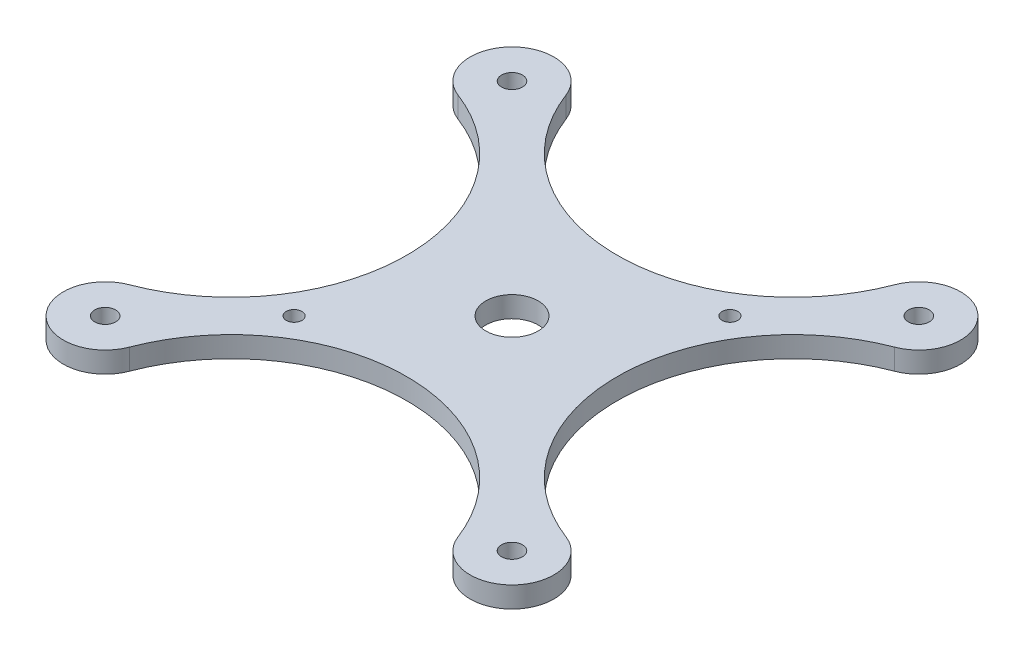
ISO-10303-21;
HEADER;
FILE_DESCRIPTION(('STEP AP214'),'2;1');
FILE_NAME('part.step','',(''),(''),'','','');
FILE_SCHEMA(('AUTOMOTIVE_DESIGN { 1 0 10303 214 1 1 1 1 }'));
ENDSEC;
DATA;
#1=APPLICATION_CONTEXT('core data for automotive mechanical design processes');
#2=APPLICATION_PROTOCOL_DEFINITION('international standard','automotive_design',2000,#1);
#3=PRODUCT_CONTEXT('',#1,'mechanical');
#4=PRODUCT('Part','Part','',(#3));
#5=PRODUCT_RELATED_PRODUCT_CATEGORY('part','',(#4));
#6=PRODUCT_DEFINITION_FORMATION('','',#4);
#7=PRODUCT_DEFINITION_CONTEXT('part definition',#1,'design');
#8=PRODUCT_DEFINITION('design','',#6,#7);
#9=PRODUCT_DEFINITION_SHAPE('','',#8);
#10=(LENGTH_UNIT() NAMED_UNIT(*) SI_UNIT(.MILLI.,.METRE.));
#11=(NAMED_UNIT(*) PLANE_ANGLE_UNIT() SI_UNIT($,.RADIAN.));
#12=(NAMED_UNIT(*) SI_UNIT($,.STERADIAN.) SOLID_ANGLE_UNIT());
#13=UNCERTAINTY_MEASURE_WITH_UNIT(LENGTH_MEASURE(1.E-05),#10,'distance_accuracy_value','');
#14=(GEOMETRIC_REPRESENTATION_CONTEXT(3) GLOBAL_UNCERTAINTY_ASSIGNED_CONTEXT((#13)) GLOBAL_UNIT_ASSIGNED_CONTEXT((#10,
#11,#12)) REPRESENTATION_CONTEXT('',''));
#15=CARTESIAN_POINT('',(0.,0.,0.));
#16=DIRECTION('',(0.,0.,1.));
#17=DIRECTION('',(1.,0.,0.));
#18=AXIS2_PLACEMENT_3D('',#15,#16,#17);
#19=CARTESIAN_POINT('',(-46.3071031753568,4.,-19.4454364826301));
#20=DIRECTION('',(0.,1.,0.));
#21=DIRECTION('',(0.,0.,1.));
#22=AXIS2_PLACEMENT_3D('',#19,#20,#21);
#23=PLANE('',#22);
#24=CARTESIAN_POINT('',(20.8313657737557,4.,-20.8313657737557));
#25=DIRECTION('',(0.,1.,0.));
#26=DIRECTION('',(0.,0.,1.));
#27=AXIS2_PLACEMENT_3D('',#24,#25,#26);
#28=CIRCLE('',#27,1.5);
#29=CARTESIAN_POINT('',(20.8313657737557,4.,-19.3313657737557));
#30=VERTEX_POINT('',#29);
#31=EDGE_CURVE('E216',#30,#30,#28,.T.);
#32=ORIENTED_EDGE('',*,*,#31,.F.);
#33=EDGE_LOOP('',(#32));
#34=FACE_BOUND('',#33,.T.);
#35=CARTESIAN_POINT('',(-38.8908729652606,4.,38.8908729652596));
#36=DIRECTION('',(0.,1.,0.));
#37=DIRECTION('',(0.,0.,1.));
#38=AXIS2_PLACEMENT_3D('',#35,#36,#37);
#39=CIRCLE('',#38,2.);
#40=CARTESIAN_POINT('',(-38.8908729652606,4.,40.8908729652596));
#41=VERTEX_POINT('',#40);
#42=EDGE_CURVE('E204',#41,#41,#39,.T.);
#43=ORIENTED_EDGE('',*,*,#42,.F.);
#44=EDGE_LOOP('',(#43));
#45=FACE_BOUND('',#44,.T.);
#46=CARTESIAN_POINT('',(38.8908729652606,4.,-38.8908729652596));
#47=DIRECTION('',(0.,1.,0.));
#48=DIRECTION('',(0.,0.,1.));
#49=AXIS2_PLACEMENT_3D('',#46,#47,#48);
#50=CIRCLE('',#49,2.);
#51=CARTESIAN_POINT('',(38.8908729652606,4.,-36.8908729652596));
#52=VERTEX_POINT('',#51);
#53=EDGE_CURVE('E192',#52,#52,#50,.T.);
#54=ORIENTED_EDGE('',*,*,#53,.F.);
#55=EDGE_LOOP('',(#54));
#56=FACE_BOUND('',#55,.T.);
#57=CARTESIAN_POINT('',(-38.8908729652601,4.,-38.8908729652601));
#58=DIRECTION('',(0.,1.,0.));
#59=DIRECTION('',(0.,0.,1.));
#60=AXIS2_PLACEMENT_3D('',#57,#58,#59);
#61=CIRCLE('',#60,8.);
#62=CARTESIAN_POINT('',(-31.4160515510095,4.,-41.7416701914865));
#63=VERTEX_POINT('',#62);
#64=CARTESIAN_POINT('',(-41.7416701914865,4.,-31.4160515510095));
#65=VERTEX_POINT('',#64);
#66=EDGE_CURVE('E155',#63,#65,#61,.T.);
#67=ORIENTED_EDGE('',*,*,#66,.T.);
#68=CARTESIAN_POINT('',(-53.7233333854534,4.,0.));
#69=DIRECTION('',(0.,-1.,0.));
#70=DIRECTION('',(0.,0.,1.));
#71=AXIS2_PLACEMENT_3D('',#68,#69,#70);
#72=CIRCLE('',#71,33.6233333854534);
#73=CARTESIAN_POINT('',(-41.7416701914865,4.,31.4160515510095));
#74=VERTEX_POINT('',#73);
#75=EDGE_CURVE('E103',#65,#74,#72,.T.);
#76=ORIENTED_EDGE('',*,*,#75,.T.);
#77=CARTESIAN_POINT('',(-38.8908729652606,4.,38.8908729652596));
#78=DIRECTION('',(0.,1.,0.));
#79=DIRECTION('',(0.,0.,1.));
#80=AXIS2_PLACEMENT_3D('',#77,#78,#79);
#81=CIRCLE('',#80,8.);
#82=CARTESIAN_POINT('',(-31.41605155101,4.,41.7416701914863));
#83=VERTEX_POINT('',#82);
#84=EDGE_CURVE('E170',#74,#83,#81,.T.);
#85=ORIENTED_EDGE('',*,*,#84,.T.);
#86=CARTESIAN_POINT('',(0.,4.,53.7233333854534));
#87=DIRECTION('',(0.,-1.,0.));
#88=DIRECTION('',(0.,0.,1.));
#89=AXIS2_PLACEMENT_3D('',#86,#87,#88);
#90=CIRCLE('',#89,33.6233333854534);
#91=CARTESIAN_POINT('',(31.4160515510095,4.,41.7416701914865));
#92=VERTEX_POINT('',#91);
#93=EDGE_CURVE('E183',#83,#92,#90,.T.);
#94=ORIENTED_EDGE('',*,*,#93,.T.);
#95=CARTESIAN_POINT('',(38.8908729652606,4.,38.8908729652596));
#96=DIRECTION('',(0.,1.,0.));
#97=DIRECTION('',(0.,0.,1.));
#98=AXIS2_PLACEMENT_3D('',#95,#96,#97);
#99=CIRCLE('',#98,7.99999999999999);
#100=CARTESIAN_POINT('',(41.7416701914867,4.,31.4160515510089));
#101=VERTEX_POINT('',#100);
#102=EDGE_CURVE('E122',#92,#101,#99,.T.);
#103=ORIENTED_EDGE('',*,*,#102,.T.);
#104=CARTESIAN_POINT('',(53.7233333854534,4.,0.));
#105=DIRECTION('',(0.,-1.,0.));
#106=DIRECTION('',(0.,0.,1.));
#107=AXIS2_PLACEMENT_3D('',#104,#105,#106);
#108=CIRCLE('',#107,33.6233333854534);
#109=CARTESIAN_POINT('',(41.7416701914865,4.,-31.4160515510095));
#110=VERTEX_POINT('',#109);
#111=EDGE_CURVE('E116',#101,#110,#108,.T.);
#112=ORIENTED_EDGE('',*,*,#111,.T.);
#113=CARTESIAN_POINT('',(38.8908729652606,4.,-38.8908729652596));
#114=DIRECTION('',(0.,1.,0.));
#115=DIRECTION('',(0.,0.,1.));
#116=AXIS2_PLACEMENT_3D('',#113,#114,#115);
#117=CIRCLE('',#116,7.99999999999998);
#118=CARTESIAN_POINT('',(31.4160515510101,4.,-41.7416701914863));
#119=VERTEX_POINT('',#118);
#120=EDGE_CURVE('E120',#110,#119,#117,.T.);
#121=ORIENTED_EDGE('',*,*,#120,.T.);
#122=CARTESIAN_POINT('',(0.,4.,-53.7233333854534));
#123=DIRECTION('',(0.,-1.,0.));
#124=DIRECTION('',(0.,0.,1.));
#125=AXIS2_PLACEMENT_3D('',#122,#123,#124);
#126=CIRCLE('',#125,33.6233333854534);
#127=EDGE_CURVE('E60',#119,#63,#126,.T.);
#128=ORIENTED_EDGE('',*,*,#127,.T.);
#129=EDGE_LOOP('',(#67,#76,#85,#94,#103,#112,#121,#128));
#130=FACE_BOUND('',#129,.T.);
#131=CARTESIAN_POINT('',(-38.8908729652601,4.,-38.8908729652601));
#132=DIRECTION('',(0.,1.,0.));
#133=DIRECTION('',(0.,0.,1.));
#134=AXIS2_PLACEMENT_3D('',#131,#132,#133);
#135=CIRCLE('',#134,1.99999999999941);
#136=CARTESIAN_POINT('',(-38.8908729652601,4.,-36.8908729652607));
#137=VERTEX_POINT('',#136);
#138=EDGE_CURVE('E144',#137,#137,#135,.T.);
#139=ORIENTED_EDGE('',*,*,#138,.F.);
#140=EDGE_LOOP('',(#139));
#141=FACE_BOUND('',#140,.T.);
#142=CARTESIAN_POINT('',(38.8908729652606,4.,38.8908729652596));
#143=DIRECTION('',(0.,1.,0.));
#144=DIRECTION('',(0.,0.,1.));
#145=AXIS2_PLACEMENT_3D('',#142,#143,#144);
#146=CIRCLE('',#145,2.);
#147=CARTESIAN_POINT('',(38.8908729652606,4.,40.8908729652596));
#148=VERTEX_POINT('',#147);
#149=EDGE_CURVE('E198',#148,#148,#146,.T.);
#150=ORIENTED_EDGE('',*,*,#149,.F.);
#151=EDGE_LOOP('',(#150));
#152=FACE_BOUND('',#151,.T.);
#153=CARTESIAN_POINT('',(0.,4.,0.));
#154=DIRECTION('',(0.,1.,0.));
#155=DIRECTION('',(0.,0.,1.));
#156=AXIS2_PLACEMENT_3D('',#153,#154,#155);
#157=CIRCLE('',#156,5.);
#158=CARTESIAN_POINT('',(0.,4.,5.));
#159=VERTEX_POINT('',#158);
#160=EDGE_CURVE('E210',#159,#159,#157,.T.);
#161=ORIENTED_EDGE('',*,*,#160,.F.);
#162=EDGE_LOOP('',(#161));
#163=FACE_BOUND('',#162,.T.);
#164=CARTESIAN_POINT('',(-20.8313657737557,4.,20.8313657737557));
#165=DIRECTION('',(0.,1.,0.));
#166=DIRECTION('',(0.,0.,1.));
#167=AXIS2_PLACEMENT_3D('',#164,#165,#166);
#168=CIRCLE('',#167,1.5);
#169=CARTESIAN_POINT('',(-20.8313657737557,4.,22.3313657737557));
#170=VERTEX_POINT('',#169);
#171=EDGE_CURVE('E222',#170,#170,#168,.T.);
#172=ORIENTED_EDGE('',*,*,#171,.F.);
#173=EDGE_LOOP('',(#172));
#174=FACE_BOUND('',#173,.T.);
#175=ADVANCED_FACE('F43',(#34,#45,#56,#130,#141,#152,#163,#174),#23,.T.);
#176=CARTESIAN_POINT('',(-46.3071031753568,0.,-19.4454364826301));
#177=DIRECTION('',(0.,1.,0.));
#178=DIRECTION('',(0.,0.,1.));
#179=AXIS2_PLACEMENT_3D('',#176,#177,#178);
#180=PLANE('',#179);
#181=CARTESIAN_POINT('',(-38.8908729652601,0.,-38.8908729652601));
#182=DIRECTION('',(0.,1.,0.));
#183=DIRECTION('',(0.,0.,1.));
#184=AXIS2_PLACEMENT_3D('',#181,#182,#183);
#185=CIRCLE('',#184,8.);
#186=CARTESIAN_POINT('',(-31.4160515510095,0.,-41.7416701914865));
#187=VERTEX_POINT('',#186);
#188=CARTESIAN_POINT('',(-41.7416701914865,0.,-31.4160515510095));
#189=VERTEX_POINT('',#188);
#190=EDGE_CURVE('E140',#187,#189,#185,.T.);
#191=ORIENTED_EDGE('',*,*,#190,.F.);
#192=CARTESIAN_POINT('',(0.,0.,-53.7233333854534));
#193=DIRECTION('',(0.,-1.,0.));
#194=DIRECTION('',(0.,0.,1.));
#195=AXIS2_PLACEMENT_3D('',#192,#193,#194);
#196=CIRCLE('',#195,33.6233333854534);
#197=CARTESIAN_POINT('',(31.4160515510101,0.,-41.7416701914863));
#198=VERTEX_POINT('',#197);
#199=EDGE_CURVE('E95',#198,#187,#196,.T.);
#200=ORIENTED_EDGE('',*,*,#199,.F.);
#201=CARTESIAN_POINT('',(38.8908729652606,0.,-38.8908729652596));
#202=DIRECTION('',(0.,1.,0.));
#203=DIRECTION('',(0.,0.,1.));
#204=AXIS2_PLACEMENT_3D('',#201,#202,#203);
#205=CIRCLE('',#204,7.99999999999998);
#206=CARTESIAN_POINT('',(41.7416701914865,0.,-31.4160515510095));
#207=VERTEX_POINT('',#206);
#208=EDGE_CURVE('E89',#207,#198,#205,.T.);
#209=ORIENTED_EDGE('',*,*,#208,.F.);
#210=CARTESIAN_POINT('',(53.7233333854534,0.,0.));
#211=DIRECTION('',(0.,-1.,0.));
#212=DIRECTION('',(0.,0.,1.));
#213=AXIS2_PLACEMENT_3D('',#210,#211,#212);
#214=CIRCLE('',#213,33.6233333854534);
#215=CARTESIAN_POINT('',(41.7416701914867,0.,31.4160515510089));
#216=VERTEX_POINT('',#215);
#217=EDGE_CURVE('E130',#216,#207,#214,.T.);
#218=ORIENTED_EDGE('',*,*,#217,.F.);
#219=CARTESIAN_POINT('',(38.8908729652606,0.,38.8908729652596));
#220=DIRECTION('',(0.,1.,0.));
#221=DIRECTION('',(0.,0.,1.));
#222=AXIS2_PLACEMENT_3D('',#219,#220,#221);
#223=CIRCLE('',#222,7.99999999999999);
#224=CARTESIAN_POINT('',(31.4160515510095,0.,41.7416701914865));
#225=VERTEX_POINT('',#224);
#226=EDGE_CURVE('E150',#225,#216,#223,.T.);
#227=ORIENTED_EDGE('',*,*,#226,.F.);
#228=CARTESIAN_POINT('',(0.,0.,53.7233333854534));
#229=DIRECTION('',(0.,-1.,0.));
#230=DIRECTION('',(0.,0.,1.));
#231=AXIS2_PLACEMENT_3D('',#228,#229,#230);
#232=CIRCLE('',#231,33.6233333854534);
#233=CARTESIAN_POINT('',(-31.41605155101,0.,41.7416701914863));
#234=VERTEX_POINT('',#233);
#235=EDGE_CURVE('E148',#234,#225,#232,.T.);
#236=ORIENTED_EDGE('',*,*,#235,.F.);
#237=CARTESIAN_POINT('',(-38.8908729652606,0.,38.8908729652596));
#238=DIRECTION('',(0.,1.,0.));
#239=DIRECTION('',(0.,0.,1.));
#240=AXIS2_PLACEMENT_3D('',#237,#238,#239);
#241=CIRCLE('',#240,8.);
#242=CARTESIAN_POINT('',(-41.7416701914865,0.,31.4160515510095));
#243=VERTEX_POINT('',#242);
#244=EDGE_CURVE('E146',#243,#234,#241,.T.);
#245=ORIENTED_EDGE('',*,*,#244,.F.);
#246=CARTESIAN_POINT('',(-53.7233333854534,0.,0.));
#247=DIRECTION('',(0.,-1.,0.));
#248=DIRECTION('',(0.,0.,1.));
#249=AXIS2_PLACEMENT_3D('',#246,#247,#248);
#250=CIRCLE('',#249,33.6233333854534);
#251=EDGE_CURVE('E143',#189,#243,#250,.T.);
#252=ORIENTED_EDGE('',*,*,#251,.F.);
#253=EDGE_LOOP('',(#191,#200,#209,#218,#227,#236,#245,#252));
#254=FACE_BOUND('',#253,.T.);
#255=CARTESIAN_POINT('',(-38.8908729652601,0.,-38.8908729652601));
#256=DIRECTION('',(0.,1.,0.));
#257=DIRECTION('',(0.,0.,1.));
#258=AXIS2_PLACEMENT_3D('',#255,#256,#257);
#259=CIRCLE('',#258,1.99999999999941);
#260=CARTESIAN_POINT('',(-38.8908729652601,0.,-36.8908729652607));
#261=VERTEX_POINT('',#260);
#262=EDGE_CURVE('E189',#261,#261,#259,.T.);
#263=ORIENTED_EDGE('',*,*,#262,.T.);
#264=EDGE_LOOP('',(#263));
#265=FACE_BOUND('',#264,.T.);
#266=CARTESIAN_POINT('',(38.8908729652606,0.,-38.8908729652596));
#267=DIRECTION('',(0.,1.,0.));
#268=DIRECTION('',(0.,0.,1.));
#269=AXIS2_PLACEMENT_3D('',#266,#267,#268);
#270=CIRCLE('',#269,2.);
#271=CARTESIAN_POINT('',(38.8908729652606,0.,-36.8908729652596));
#272=VERTEX_POINT('',#271);
#273=EDGE_CURVE('E195',#272,#272,#270,.T.);
#274=ORIENTED_EDGE('',*,*,#273,.T.);
#275=EDGE_LOOP('',(#274));
#276=FACE_BOUND('',#275,.T.);
#277=CARTESIAN_POINT('',(38.8908729652606,0.,38.8908729652596));
#278=DIRECTION('',(0.,1.,0.));
#279=DIRECTION('',(0.,0.,1.));
#280=AXIS2_PLACEMENT_3D('',#277,#278,#279);
#281=CIRCLE('',#280,2.);
#282=CARTESIAN_POINT('',(38.8908729652606,0.,40.8908729652596));
#283=VERTEX_POINT('',#282);
#284=EDGE_CURVE('E201',#283,#283,#281,.T.);
#285=ORIENTED_EDGE('',*,*,#284,.T.);
#286=EDGE_LOOP('',(#285));
#287=FACE_BOUND('',#286,.T.);
#288=CARTESIAN_POINT('',(-38.8908729652606,0.,38.8908729652596));
#289=DIRECTION('',(0.,1.,0.));
#290=DIRECTION('',(0.,0.,1.));
#291=AXIS2_PLACEMENT_3D('',#288,#289,#290);
#292=CIRCLE('',#291,2.);
#293=CARTESIAN_POINT('',(-38.8908729652606,0.,40.8908729652596));
#294=VERTEX_POINT('',#293);
#295=EDGE_CURVE('E207',#294,#294,#292,.T.);
#296=ORIENTED_EDGE('',*,*,#295,.T.);
#297=EDGE_LOOP('',(#296));
#298=FACE_BOUND('',#297,.T.);
#299=CARTESIAN_POINT('',(0.,0.,0.));
#300=DIRECTION('',(0.,1.,0.));
#301=DIRECTION('',(0.,0.,1.));
#302=AXIS2_PLACEMENT_3D('',#299,#300,#301);
#303=CIRCLE('',#302,5.);
#304=CARTESIAN_POINT('',(0.,0.,5.));
#305=VERTEX_POINT('',#304);
#306=EDGE_CURVE('E213',#305,#305,#303,.T.);
#307=ORIENTED_EDGE('',*,*,#306,.T.);
#308=EDGE_LOOP('',(#307));
#309=FACE_BOUND('',#308,.T.);
#310=CARTESIAN_POINT('',(20.8313657737557,0.,-20.8313657737557));
#311=DIRECTION('',(0.,1.,0.));
#312=DIRECTION('',(0.,0.,1.));
#313=AXIS2_PLACEMENT_3D('',#310,#311,#312);
#314=CIRCLE('',#313,1.5);
#315=CARTESIAN_POINT('',(20.8313657737557,0.,-19.3313657737557));
#316=VERTEX_POINT('',#315);
#317=EDGE_CURVE('E219',#316,#316,#314,.T.);
#318=ORIENTED_EDGE('',*,*,#317,.T.);
#319=EDGE_LOOP('',(#318));
#320=FACE_BOUND('',#319,.T.);
#321=CARTESIAN_POINT('',(-20.8313657737557,0.,20.8313657737557));
#322=DIRECTION('',(0.,1.,0.));
#323=DIRECTION('',(0.,0.,1.));
#324=AXIS2_PLACEMENT_3D('',#321,#322,#323);
#325=CIRCLE('',#324,1.5);
#326=CARTESIAN_POINT('',(-20.8313657737557,0.,22.3313657737557));
#327=VERTEX_POINT('',#326);
#328=EDGE_CURVE('E225',#327,#327,#325,.T.);
#329=ORIENTED_EDGE('',*,*,#328,.T.);
#330=EDGE_LOOP('',(#329));
#331=FACE_BOUND('',#330,.T.);
#332=ADVANCED_FACE('F174',(#254,#265,#276,#287,#298,#309,#320,#331),#180,.F.);
#333=CARTESIAN_POINT('',(-38.8908729652601,4.,-38.8908729652601));
#334=DIRECTION('',(0.,-1.,0.));
#335=DIRECTION('',(0.,0.,-1.));
#336=AXIS2_PLACEMENT_3D('',#333,#334,#335);
#337=CYLINDRICAL_SURFACE('',#336,8.);
#338=ORIENTED_EDGE('',*,*,#190,.T.);
#339=DIRECTION('',(0.,-1.,0.));
#340=VECTOR('',#339,1.);
#341=CARTESIAN_POINT('',(-41.7416701914865,4.,-31.4160515510095));
#342=LINE('',#341,#340);
#343=EDGE_CURVE('E11',#65,#189,#342,.T.);
#344=ORIENTED_EDGE('',*,*,#343,.F.);
#345=ORIENTED_EDGE('',*,*,#66,.F.);
#346=DIRECTION('',(0.,-1.,0.));
#347=VECTOR('',#346,1.);
#348=CARTESIAN_POINT('',(-31.4160515510095,4.,-41.7416701914865));
#349=LINE('',#348,#347);
#350=EDGE_CURVE('E136',#63,#187,#349,.T.);
#351=ORIENTED_EDGE('',*,*,#350,.T.);
#352=EDGE_LOOP('',(#338,#344,#345,#351));
#353=FACE_BOUND('',#352,.T.);
#354=ADVANCED_FACE('F45',(#353),#337,.T.);
#355=CARTESIAN_POINT('',(-53.7233333854534,4.,0.));
#356=DIRECTION('',(0.,-1.,0.));
#357=DIRECTION('',(0.,0.,-1.));
#358=AXIS2_PLACEMENT_3D('',#355,#356,#357);
#359=CYLINDRICAL_SURFACE('',#358,33.6233333854534);
#360=ORIENTED_EDGE('',*,*,#251,.T.);
#361=DIRECTION('',(0.,-1.,0.));
#362=VECTOR('',#361,1.);
#363=CARTESIAN_POINT('',(-41.7416701914865,4.,31.4160515510095));
#364=LINE('',#363,#362);
#365=EDGE_CURVE('E52',#74,#243,#364,.T.);
#366=ORIENTED_EDGE('',*,*,#365,.F.);
#367=ORIENTED_EDGE('',*,*,#75,.F.);
#368=ORIENTED_EDGE('',*,*,#343,.T.);
#369=EDGE_LOOP('',(#360,#366,#367,#368));
#370=FACE_BOUND('',#369,.T.);
#371=ADVANCED_FACE('F259',(#370),#359,.F.);
#372=CARTESIAN_POINT('',(-38.8908729652606,4.,38.8908729652596));
#373=DIRECTION('',(0.,-1.,0.));
#374=DIRECTION('',(0.,0.,-1.));
#375=AXIS2_PLACEMENT_3D('',#372,#373,#374);
#376=CYLINDRICAL_SURFACE('',#375,8.);
#377=ORIENTED_EDGE('',*,*,#244,.T.);
#378=DIRECTION('',(0.,-1.,0.));
#379=VECTOR('',#378,1.);
#380=CARTESIAN_POINT('',(-31.41605155101,4.,41.7416701914863));
#381=LINE('',#380,#379);
#382=EDGE_CURVE('E162',#83,#234,#381,.T.);
#383=ORIENTED_EDGE('',*,*,#382,.F.);
#384=ORIENTED_EDGE('',*,*,#84,.F.);
#385=ORIENTED_EDGE('',*,*,#365,.T.);
#386=EDGE_LOOP('',(#377,#383,#384,#385));
#387=FACE_BOUND('',#386,.T.);
#388=ADVANCED_FACE('F168',(#387),#376,.T.);
#389=CARTESIAN_POINT('',(0.,4.,53.7233333854534));
#390=DIRECTION('',(0.,-1.,0.));
#391=DIRECTION('',(0.,0.,-1.));
#392=AXIS2_PLACEMENT_3D('',#389,#390,#391);
#393=CYLINDRICAL_SURFACE('',#392,33.6233333854534);
#394=ORIENTED_EDGE('',*,*,#235,.T.);
#395=DIRECTION('',(0.,-1.,0.));
#396=VECTOR('',#395,1.);
#397=CARTESIAN_POINT('',(31.4160515510095,4.,41.7416701914865));
#398=LINE('',#397,#396);
#399=EDGE_CURVE('E159',#92,#225,#398,.T.);
#400=ORIENTED_EDGE('',*,*,#399,.F.);
#401=ORIENTED_EDGE('',*,*,#93,.F.);
#402=ORIENTED_EDGE('',*,*,#382,.T.);
#403=EDGE_LOOP('',(#394,#400,#401,#402));
#404=FACE_BOUND('',#403,.T.);
#405=ADVANCED_FACE('F179',(#404),#393,.F.);
#406=CARTESIAN_POINT('',(38.8908729652606,4.,38.8908729652596));
#407=DIRECTION('',(0.,-1.,0.));
#408=DIRECTION('',(0.,0.,-1.));
#409=AXIS2_PLACEMENT_3D('',#406,#407,#408);
#410=CYLINDRICAL_SURFACE('',#409,7.99999999999999);
#411=ORIENTED_EDGE('',*,*,#226,.T.);
#412=DIRECTION('',(0.,-1.,0.));
#413=VECTOR('',#412,1.);
#414=CARTESIAN_POINT('',(41.7416701914867,4.,31.4160515510089));
#415=LINE('',#414,#413);
#416=EDGE_CURVE('E131',#101,#216,#415,.T.);
#417=ORIENTED_EDGE('',*,*,#416,.F.);
#418=ORIENTED_EDGE('',*,*,#102,.F.);
#419=ORIENTED_EDGE('',*,*,#399,.T.);
#420=EDGE_LOOP('',(#411,#417,#418,#419));
#421=FACE_BOUND('',#420,.T.);
#422=ADVANCED_FACE('F182',(#421),#410,.T.);
#423=CARTESIAN_POINT('',(53.7233333854534,4.,0.));
#424=DIRECTION('',(0.,-1.,0.));
#425=DIRECTION('',(0.,0.,-1.));
#426=AXIS2_PLACEMENT_3D('',#423,#424,#425);
#427=CYLINDRICAL_SURFACE('',#426,33.6233333854534);
#428=ORIENTED_EDGE('',*,*,#217,.T.);
#429=DIRECTION('',(0.,-1.,0.));
#430=VECTOR('',#429,1.);
#431=CARTESIAN_POINT('',(41.7416701914865,4.,-31.4160515510095));
#432=LINE('',#431,#430);
#433=EDGE_CURVE('E127',#110,#207,#432,.T.);
#434=ORIENTED_EDGE('',*,*,#433,.F.);
#435=ORIENTED_EDGE('',*,*,#111,.F.);
#436=ORIENTED_EDGE('',*,*,#416,.T.);
#437=EDGE_LOOP('',(#428,#434,#435,#436));
#438=FACE_BOUND('',#437,.T.);
#439=ADVANCED_FACE('F128',(#438),#427,.F.);
#440=CARTESIAN_POINT('',(38.8908729652606,4.,-38.8908729652596));
#441=DIRECTION('',(0.,-1.,0.));
#442=DIRECTION('',(0.,0.,-1.));
#443=AXIS2_PLACEMENT_3D('',#440,#441,#442);
#444=CYLINDRICAL_SURFACE('',#443,7.99999999999998);
#445=ORIENTED_EDGE('',*,*,#208,.T.);
#446=DIRECTION('',(0.,-1.,0.));
#447=VECTOR('',#446,1.);
#448=CARTESIAN_POINT('',(31.4160515510101,4.,-41.7416701914863));
#449=LINE('',#448,#447);
#450=EDGE_CURVE('E132',#119,#198,#449,.T.);
#451=ORIENTED_EDGE('',*,*,#450,.F.);
#452=ORIENTED_EDGE('',*,*,#120,.F.);
#453=ORIENTED_EDGE('',*,*,#433,.T.);
#454=EDGE_LOOP('',(#445,#451,#452,#453));
#455=FACE_BOUND('',#454,.T.);
#456=ADVANCED_FACE('F134',(#455),#444,.T.);
#457=CARTESIAN_POINT('',(0.,4.,-53.7233333854534));
#458=DIRECTION('',(0.,-1.,0.));
#459=DIRECTION('',(0.,0.,-1.));
#460=AXIS2_PLACEMENT_3D('',#457,#458,#459);
#461=CYLINDRICAL_SURFACE('',#460,33.6233333854534);
#462=ORIENTED_EDGE('',*,*,#199,.T.);
#463=ORIENTED_EDGE('',*,*,#350,.F.);
#464=ORIENTED_EDGE('',*,*,#127,.F.);
#465=ORIENTED_EDGE('',*,*,#450,.T.);
#466=EDGE_LOOP('',(#462,#463,#464,#465));
#467=FACE_BOUND('',#466,.T.);
#468=ADVANCED_FACE('F247',(#467),#461,.F.);
#469=CARTESIAN_POINT('',(-38.8908729652601,4.,-38.8908729652601));
#470=DIRECTION('',(0.,-1.,0.));
#471=DIRECTION('',(0.,0.,-1.));
#472=AXIS2_PLACEMENT_3D('',#469,#470,#471);
#473=CYLINDRICAL_SURFACE('',#472,1.99999999999941);
#474=ORIENTED_EDGE('',*,*,#138,.T.);
#475=EDGE_LOOP('',(#474));
#476=FACE_BOUND('',#475,.T.);
#477=ORIENTED_EDGE('',*,*,#262,.F.);
#478=EDGE_LOOP('',(#477));
#479=FACE_BOUND('',#478,.T.);
#480=ADVANCED_FACE('F244',(#476,#479),#473,.F.);
#481=CARTESIAN_POINT('',(38.8908729652606,4.,-38.8908729652596));
#482=DIRECTION('',(0.,-1.,0.));
#483=DIRECTION('',(0.,0.,-1.));
#484=AXIS2_PLACEMENT_3D('',#481,#482,#483);
#485=CYLINDRICAL_SURFACE('',#484,2.);
#486=ORIENTED_EDGE('',*,*,#53,.T.);
#487=EDGE_LOOP('',(#486));
#488=FACE_BOUND('',#487,.T.);
#489=ORIENTED_EDGE('',*,*,#273,.F.);
#490=EDGE_LOOP('',(#489));
#491=FACE_BOUND('',#490,.T.);
#492=ADVANCED_FACE('F322',(#488,#491),#485,.F.);
#493=CARTESIAN_POINT('',(38.8908729652606,4.,38.8908729652596));
#494=DIRECTION('',(0.,-1.,0.));
#495=DIRECTION('',(0.,0.,-1.));
#496=AXIS2_PLACEMENT_3D('',#493,#494,#495);
#497=CYLINDRICAL_SURFACE('',#496,2.);
#498=ORIENTED_EDGE('',*,*,#149,.T.);
#499=EDGE_LOOP('',(#498));
#500=FACE_BOUND('',#499,.T.);
#501=ORIENTED_EDGE('',*,*,#284,.F.);
#502=EDGE_LOOP('',(#501));
#503=FACE_BOUND('',#502,.T.);
#504=ADVANCED_FACE('F330',(#500,#503),#497,.F.);
#505=CARTESIAN_POINT('',(-38.8908729652606,4.,38.8908729652596));
#506=DIRECTION('',(0.,-1.,0.));
#507=DIRECTION('',(0.,0.,-1.));
#508=AXIS2_PLACEMENT_3D('',#505,#506,#507);
#509=CYLINDRICAL_SURFACE('',#508,2.);
#510=ORIENTED_EDGE('',*,*,#42,.T.);
#511=EDGE_LOOP('',(#510));
#512=FACE_BOUND('',#511,.T.);
#513=ORIENTED_EDGE('',*,*,#295,.F.);
#514=EDGE_LOOP('',(#513));
#515=FACE_BOUND('',#514,.T.);
#516=ADVANCED_FACE('F338',(#512,#515),#509,.F.);
#517=CARTESIAN_POINT('',(0.,4.,0.));
#518=DIRECTION('',(0.,-1.,0.));
#519=DIRECTION('',(0.,0.,-1.));
#520=AXIS2_PLACEMENT_3D('',#517,#518,#519);
#521=CYLINDRICAL_SURFACE('',#520,5.);
#522=ORIENTED_EDGE('',*,*,#160,.T.);
#523=EDGE_LOOP('',(#522));
#524=FACE_BOUND('',#523,.T.);
#525=ORIENTED_EDGE('',*,*,#306,.F.);
#526=EDGE_LOOP('',(#525));
#527=FACE_BOUND('',#526,.T.);
#528=ADVANCED_FACE('F347',(#524,#527),#521,.F.);
#529=CARTESIAN_POINT('',(20.8313657737557,4.,-20.8313657737557));
#530=DIRECTION('',(0.,-1.,0.));
#531=DIRECTION('',(0.,0.,-1.));
#532=AXIS2_PLACEMENT_3D('',#529,#530,#531);
#533=CYLINDRICAL_SURFACE('',#532,1.5);
#534=ORIENTED_EDGE('',*,*,#31,.T.);
#535=EDGE_LOOP('',(#534));
#536=FACE_BOUND('',#535,.T.);
#537=ORIENTED_EDGE('',*,*,#317,.F.);
#538=EDGE_LOOP('',(#537));
#539=FACE_BOUND('',#538,.T.);
#540=ADVANCED_FACE('F356',(#536,#539),#533,.F.);
#541=CARTESIAN_POINT('',(-20.8313657737557,4.,20.8313657737557));
#542=DIRECTION('',(0.,-1.,0.));
#543=DIRECTION('',(0.,0.,-1.));
#544=AXIS2_PLACEMENT_3D('',#541,#542,#543);
#545=CYLINDRICAL_SURFACE('',#544,1.5);
#546=ORIENTED_EDGE('',*,*,#171,.T.);
#547=EDGE_LOOP('',(#546));
#548=FACE_BOUND('',#547,.T.);
#549=ORIENTED_EDGE('',*,*,#328,.F.);
#550=EDGE_LOOP('',(#549));
#551=FACE_BOUND('',#550,.T.);
#552=ADVANCED_FACE('F231',(#548,#551),#545,.F.);
#553=CLOSED_SHELL('',(#175,#332,#354,#371,#388,#405,#422,#439,#456,#468,#480,#492,#504,#516,
#528,#540,#552));
#554=MANIFOLD_SOLID_BREP('B2',#553);
#555=ADVANCED_BREP_SHAPE_REPRESENTATION('',(#18,#554),#14);
#556=SHAPE_DEFINITION_REPRESENTATION(#9,#555);
ENDSEC;
END-ISO-10303-21;
